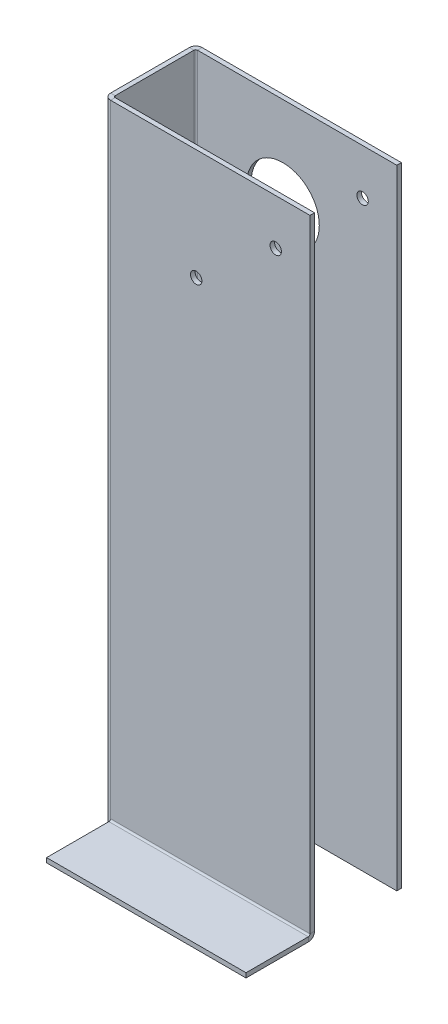
ISO-10303-21;
HEADER;
FILE_DESCRIPTION(('STEP AP214'),'2;1');
FILE_NAME('part.step','',(''),(''),'','','');
FILE_SCHEMA(('AUTOMOTIVE_DESIGN { 1 0 10303 214 1 1 1 1 }'));
ENDSEC;
DATA;
#1=APPLICATION_CONTEXT('core data for automotive mechanical design processes');
#2=APPLICATION_PROTOCOL_DEFINITION('international standard','automotive_design',2000,#1);
#3=PRODUCT_CONTEXT('',#1,'mechanical');
#4=PRODUCT('Part','Part','',(#3));
#5=PRODUCT_RELATED_PRODUCT_CATEGORY('part','',(#4));
#6=PRODUCT_DEFINITION_FORMATION('','',#4);
#7=PRODUCT_DEFINITION_CONTEXT('part definition',#1,'design');
#8=PRODUCT_DEFINITION('design','',#6,#7);
#9=PRODUCT_DEFINITION_SHAPE('','',#8);
#10=(LENGTH_UNIT() NAMED_UNIT(*) SI_UNIT(.MILLI.,.METRE.));
#11=(NAMED_UNIT(*) PLANE_ANGLE_UNIT() SI_UNIT($,.RADIAN.));
#12=(NAMED_UNIT(*) SI_UNIT($,.STERADIAN.) SOLID_ANGLE_UNIT());
#13=UNCERTAINTY_MEASURE_WITH_UNIT(LENGTH_MEASURE(1.E-05),#10,'distance_accuracy_value','');
#14=(GEOMETRIC_REPRESENTATION_CONTEXT(3) GLOBAL_UNCERTAINTY_ASSIGNED_CONTEXT((#13)) GLOBAL_UNIT_ASSIGNED_CONTEXT((#10,
#11,#12)) REPRESENTATION_CONTEXT('',''));
#15=CARTESIAN_POINT('',(0.,0.,0.));
#16=DIRECTION('',(0.,0.,1.));
#17=DIRECTION('',(1.,0.,0.));
#18=AXIS2_PLACEMENT_3D('',#15,#16,#17);
#19=CARTESIAN_POINT('',(2.73660000000001,2.7366,0.));
#20=DIRECTION('',(1.,0.,0.));
#21=DIRECTION('',(0.,1.,0.));
#22=AXIS2_PLACEMENT_3D('',#19,#20,#21);
#23=PLANE('',#22);
#24=DIRECTION('',(0.,1.,0.));
#25=VECTOR('',#24,1.);
#26=CARTESIAN_POINT('',(2.7366,275.,-2.));
#27=LINE('',#26,#25);
#28=CARTESIAN_POINT('',(2.73660000000001,2.73660000000001,-2.));
#29=VERTEX_POINT('',#28);
#30=CARTESIAN_POINT('',(2.7366,0.,-2.));
#31=VERTEX_POINT('',#30);
#32=EDGE_CURVE('E376',#29,#31,#27,.F.);
#33=ORIENTED_EDGE('',*,*,#32,.F.);
#34=CARTESIAN_POINT('',(2.73660000000001,2.7366,0.7366));
#35=DIRECTION('',(1.,0.,0.));
#36=DIRECTION('',(0.,0.,-1.));
#37=AXIS2_PLACEMENT_3D('',#34,#35,#36);
#38=CIRCLE('',#37,2.7366);
#39=CARTESIAN_POINT('',(2.7366,0.100997602065135,0.));
#40=VERTEX_POINT('',#39);
#41=EDGE_CURVE('E269',#29,#40,#38,.F.);
#42=ORIENTED_EDGE('',*,*,#41,.T.);
#43=DIRECTION('',(0.,-1.,0.));
#44=VECTOR('',#43,1.);
#45=CARTESIAN_POINT('',(2.73660000000001,2.7366,0.));
#46=LINE('',#45,#44);
#47=CARTESIAN_POINT('',(2.7366,0.,0.));
#48=VERTEX_POINT('',#47);
#49=EDGE_CURVE('E285',#40,#48,#46,.T.);
#50=ORIENTED_EDGE('',*,*,#49,.T.);
#51=DIRECTION('',(0.,0.,1.));
#52=VECTOR('',#51,1.);
#53=CARTESIAN_POINT('',(2.7366,0.,-2.));
#54=LINE('',#53,#52);
#55=EDGE_CURVE('E120',#31,#48,#54,.T.);
#56=ORIENTED_EDGE('',*,*,#55,.F.);
#57=EDGE_LOOP('',(#33,#42,#50,#56));
#58=FACE_BOUND('',#57,.T.);
#59=ADVANCED_FACE('F97',(#58),#23,.T.);
#60=CARTESIAN_POINT('',(0.,0.,-2.));
#61=DIRECTION('',(0.,0.,-1.));
#62=DIRECTION('',(-1.,0.,0.));
#63=AXIS2_PLACEMENT_3D('',#60,#61,#62);
#64=PLANE('',#63);
#65=CARTESIAN_POINT('',(75.,255.,-2.));
#66=DIRECTION('',(0.,0.,-1.));
#67=DIRECTION('',(-1.,0.,0.));
#68=AXIS2_PLACEMENT_3D('',#65,#66,#67);
#69=CIRCLE('',#68,2.50000000000001);
#70=CARTESIAN_POINT('',(72.5,255.,-2.));
#71=VERTEX_POINT('',#70);
#72=EDGE_CURVE('E527',#71,#71,#69,.F.);
#73=ORIENTED_EDGE('',*,*,#72,.T.);
#74=EDGE_LOOP('',(#73));
#75=FACE_BOUND('',#74,.T.);
#76=CARTESIAN_POINT('',(40.19,226.48,-2.));
#77=DIRECTION('',(0.,0.,-1.));
#78=DIRECTION('',(-1.,0.,0.));
#79=AXIS2_PLACEMENT_3D('',#76,#77,#78);
#80=CIRCLE('',#79,2.5);
#81=CARTESIAN_POINT('',(37.69,226.48,-2.));
#82=VERTEX_POINT('',#81);
#83=EDGE_CURVE('E534',#82,#82,#80,.F.);
#84=ORIENTED_EDGE('',*,*,#83,.T.);
#85=EDGE_LOOP('',(#84));
#86=FACE_BOUND('',#85,.T.);
#87=DIRECTION('',(0.,1.,0.));
#88=VECTOR('',#87,1.);
#89=CARTESIAN_POINT('',(90.,0.,-2.));
#90=LINE('',#89,#88);
#91=CARTESIAN_POINT('',(90.,2.73660000000001,-2.));
#92=VERTEX_POINT('',#91);
#93=CARTESIAN_POINT('',(90.,275.,-2.));
#94=VERTEX_POINT('',#93);
#95=EDGE_CURVE('E382',#92,#94,#90,.T.);
#96=ORIENTED_EDGE('',*,*,#95,.F.);
#97=DIRECTION('',(1.,0.,0.));
#98=VECTOR('',#97,1.);
#99=CARTESIAN_POINT('',(90.,2.7366,-2.));
#100=LINE('',#99,#98);
#101=EDGE_CURVE('E264',#92,#29,#100,.F.);
#102=ORIENTED_EDGE('',*,*,#101,.T.);
#103=CARTESIAN_POINT('',(2.7366,275.,-2.));
#104=VERTEX_POINT('',#103);
#105=EDGE_CURVE('E373',#104,#29,#27,.F.);
#106=ORIENTED_EDGE('',*,*,#105,.F.);
#107=DIRECTION('',(-1.,0.,0.));
#108=VECTOR('',#107,1.);
#109=CARTESIAN_POINT('',(0.,275.,-2.));
#110=LINE('',#109,#108);
#111=EDGE_CURVE('E105',#94,#104,#110,.T.);
#112=ORIENTED_EDGE('',*,*,#111,.F.);
#113=EDGE_LOOP('',(#96,#102,#106,#112));
#114=FACE_BOUND('',#113,.T.);
#115=ADVANCED_FACE('F459',(#75,#86,#114),#64,.T.);
#116=CARTESIAN_POINT('',(0.,0.,0.));
#117=DIRECTION('',(0.,0.,-1.));
#118=DIRECTION('',(-1.,0.,0.));
#119=AXIS2_PLACEMENT_3D('',#116,#117,#118);
#120=PLANE('',#119);
#121=CARTESIAN_POINT('',(75.,255.,0.));
#122=DIRECTION('',(0.,0.,1.));
#123=DIRECTION('',(1.,0.,0.));
#124=AXIS2_PLACEMENT_3D('',#121,#122,#123);
#125=CIRCLE('',#124,2.50000000000001);
#126=CARTESIAN_POINT('',(77.5,255.,0.));
#127=VERTEX_POINT('',#126);
#128=EDGE_CURVE('E531',#127,#127,#125,.T.);
#129=ORIENTED_EDGE('',*,*,#128,.F.);
#130=EDGE_LOOP('',(#129));
#131=FACE_BOUND('',#130,.T.);
#132=CARTESIAN_POINT('',(40.19,226.48,0.));
#133=DIRECTION('',(0.,0.,1.));
#134=DIRECTION('',(1.,0.,0.));
#135=AXIS2_PLACEMENT_3D('',#132,#133,#134);
#136=CIRCLE('',#135,2.5);
#137=CARTESIAN_POINT('',(42.69,226.48,0.));
#138=VERTEX_POINT('',#137);
#139=EDGE_CURVE('E263',#138,#138,#136,.T.);
#140=ORIENTED_EDGE('',*,*,#139,.F.);
#141=EDGE_LOOP('',(#140));
#142=FACE_BOUND('',#141,.T.);
#143=DIRECTION('',(1.,0.,0.));
#144=VECTOR('',#143,1.);
#145=CARTESIAN_POINT('',(90.,2.7366,0.));
#146=LINE('',#145,#144);
#147=CARTESIAN_POINT('',(90.,2.7366,0.));
#148=VERTEX_POINT('',#147);
#149=CARTESIAN_POINT('',(2.73660000000001,2.7366,0.));
#150=VERTEX_POINT('',#149);
#151=EDGE_CURVE('E278',#148,#150,#146,.F.);
#152=ORIENTED_EDGE('',*,*,#151,.F.);
#153=DIRECTION('',(0.,1.,0.));
#154=VECTOR('',#153,1.);
#155=CARTESIAN_POINT('',(90.,0.,0.));
#156=LINE('',#155,#154);
#157=CARTESIAN_POINT('',(90.,275.,0.));
#158=VERTEX_POINT('',#157);
#159=EDGE_CURVE('E380',#148,#158,#156,.T.);
#160=ORIENTED_EDGE('',*,*,#159,.T.);
#161=DIRECTION('',(-1.,0.,0.));
#162=VECTOR('',#161,1.);
#163=CARTESIAN_POINT('',(0.,275.,0.));
#164=LINE('',#163,#162);
#165=CARTESIAN_POINT('',(2.7366,275.,0.));
#166=VERTEX_POINT('',#165);
#167=EDGE_CURVE('E384',#158,#166,#164,.T.);
#168=ORIENTED_EDGE('',*,*,#167,.T.);
#169=DIRECTION('',(0.,1.,0.));
#170=VECTOR('',#169,1.);
#171=CARTESIAN_POINT('',(2.7366,275.,0.));
#172=LINE('',#171,#170);
#173=EDGE_CURVE('E360',#166,#150,#172,.F.);
#174=ORIENTED_EDGE('',*,*,#173,.T.);
#175=EDGE_LOOP('',(#152,#160,#168,#174));
#176=FACE_BOUND('',#175,.T.);
#177=ADVANCED_FACE('F391',(#131,#142,#176),#120,.F.);
#178=CARTESIAN_POINT('',(90.,0.,-2.));
#179=DIRECTION('',(1.,0.,0.));
#180=DIRECTION('',(0.,0.,-1.));
#181=AXIS2_PLACEMENT_3D('',#178,#179,#180);
#182=PLANE('',#181);
#183=ORIENTED_EDGE('',*,*,#159,.F.);
#184=DIRECTION('',(0.,0.,-1.));
#185=VECTOR('',#184,1.);
#186=CARTESIAN_POINT('',(90.,2.7366,0.));
#187=LINE('',#186,#185);
#188=EDGE_CURVE('E272',#148,#92,#187,.T.);
#189=ORIENTED_EDGE('',*,*,#188,.T.);
#190=ORIENTED_EDGE('',*,*,#95,.T.);
#191=DIRECTION('',(0.,0.,1.));
#192=VECTOR('',#191,1.);
#193=CARTESIAN_POINT('',(90.,275.,-2.));
#194=LINE('',#193,#192);
#195=EDGE_CURVE('E13',#94,#158,#194,.T.);
#196=ORIENTED_EDGE('',*,*,#195,.T.);
#197=EDGE_LOOP('',(#183,#189,#190,#196));
#198=FACE_BOUND('',#197,.T.);
#199=ADVANCED_FACE('F99',(#198),#182,.T.);
#200=CARTESIAN_POINT('',(-1.32706345912226E-13,275.,-40.));
#201=DIRECTION('',(0.,-1.,0.));
#202=DIRECTION('',(0.,0.,-1.));
#203=AXIS2_PLACEMENT_3D('',#200,#201,#202);
#204=PLANE('',#203);
#205=DIRECTION('',(-1.,0.,0.));
#206=VECTOR('',#205,1.);
#207=CARTESIAN_POINT('',(1.99999999999987,275.,-37.2634));
#208=LINE('',#207,#206);
#209=CARTESIAN_POINT('',(1.99999999999988,275.,-37.2634));
#210=VERTEX_POINT('',#209);
#211=CARTESIAN_POINT('',(-1.33573707650214E-13,275.,-37.2634));
#212=VERTEX_POINT('',#211);
#213=EDGE_CURVE('E326',#210,#212,#208,.T.);
#214=ORIENTED_EDGE('',*,*,#213,.T.);
#215=DIRECTION('',(0.,0.,-1.));
#216=VECTOR('',#215,1.);
#217=CARTESIAN_POINT('',(0.,275.,0.));
#218=LINE('',#217,#216);
#219=CARTESIAN_POINT('',(0.,275.,-2.73659999999999));
#220=VERTEX_POINT('',#219);
#221=EDGE_CURVE('E344',#220,#212,#218,.T.);
#222=ORIENTED_EDGE('',*,*,#221,.F.);
#223=DIRECTION('',(1.,0.,0.));
#224=VECTOR('',#223,1.);
#225=CARTESIAN_POINT('',(2.,275.,-2.7366));
#226=LINE('',#225,#224);
#227=CARTESIAN_POINT('',(2.,275.,-2.7366));
#228=VERTEX_POINT('',#227);
#229=EDGE_CURVE('E353',#228,#220,#226,.F.);
#230=ORIENTED_EDGE('',*,*,#229,.F.);
#231=DIRECTION('',(0.,0.,1.));
#232=VECTOR('',#231,1.);
#233=CARTESIAN_POINT('',(1.99999999999987,275.,-40.));
#234=LINE('',#233,#232);
#235=EDGE_CURVE('E348',#228,#210,#234,.F.);
#236=ORIENTED_EDGE('',*,*,#235,.T.);
#237=EDGE_LOOP('',(#214,#222,#230,#236));
#238=FACE_BOUND('',#237,.T.);
#239=ADVANCED_FACE('F409',(#238),#204,.F.);
#240=CARTESIAN_POINT('',(0.,0.,-1.99999999999999));
#241=DIRECTION('',(0.,1.,0.));
#242=DIRECTION('',(0.,0.,1.));
#243=AXIS2_PLACEMENT_3D('',#240,#241,#242);
#244=PLANE('',#243);
#245=DIRECTION('',(-1.,0.,0.));
#246=VECTOR('',#245,1.);
#247=CARTESIAN_POINT('',(1.99999999999987,0.,-37.2634));
#248=LINE('',#247,#246);
#249=CARTESIAN_POINT('',(1.99999999999987,0.,-37.2634));
#250=VERTEX_POINT('',#249);
#251=CARTESIAN_POINT('',(-1.2793585635329E-13,0.,-37.2634));
#252=VERTEX_POINT('',#251);
#253=EDGE_CURVE('E335',#250,#252,#248,.T.);
#254=ORIENTED_EDGE('',*,*,#253,.F.);
#255=DIRECTION('',(0.,0.,-1.));
#256=VECTOR('',#255,1.);
#257=CARTESIAN_POINT('',(2.,0.,-2.));
#258=LINE('',#257,#256);
#259=CARTESIAN_POINT('',(2.,0.,-2.7366));
#260=VERTEX_POINT('',#259);
#261=EDGE_CURVE('E346',#250,#260,#258,.F.);
#262=ORIENTED_EDGE('',*,*,#261,.T.);
#263=DIRECTION('',(1.,0.,0.));
#264=VECTOR('',#263,1.);
#265=CARTESIAN_POINT('',(0.,0.,-2.73659999999999));
#266=LINE('',#265,#264);
#267=CARTESIAN_POINT('',(0.,0.,-2.73659999999999));
#268=VERTEX_POINT('',#267);
#269=EDGE_CURVE('E338',#260,#268,#266,.F.);
#270=ORIENTED_EDGE('',*,*,#269,.T.);
#271=DIRECTION('',(0.,0.,1.));
#272=VECTOR('',#271,1.);
#273=CARTESIAN_POINT('',(0.,0.,0.));
#274=LINE('',#273,#272);
#275=EDGE_CURVE('E341',#252,#268,#274,.T.);
#276=ORIENTED_EDGE('',*,*,#275,.F.);
#277=EDGE_LOOP('',(#254,#262,#270,#276));
#278=FACE_BOUND('',#277,.T.);
#279=ADVANCED_FACE('F560',(#278),#244,.F.);
#280=CARTESIAN_POINT('',(0.,0.,0.));
#281=DIRECTION('',(1.,0.,0.));
#282=DIRECTION('',(0.,0.,-1.));
#283=AXIS2_PLACEMENT_3D('',#280,#281,#282);
#284=PLANE('',#283);
#285=DIRECTION('',(0.,1.,0.));
#286=VECTOR('',#285,1.);
#287=CARTESIAN_POINT('',(-1.33573707650214E-13,275.,-37.2634));
#288=LINE('',#287,#286);
#289=EDGE_CURVE('E320',#212,#252,#288,.F.);
#290=ORIENTED_EDGE('',*,*,#289,.T.);
#291=ORIENTED_EDGE('',*,*,#275,.T.);
#292=DIRECTION('',(0.,1.,0.));
#293=VECTOR('',#292,1.);
#294=CARTESIAN_POINT('',(0.,0.,-2.73659999999999));
#295=LINE('',#294,#293);
#296=EDGE_CURVE('E350',#220,#268,#295,.F.);
#297=ORIENTED_EDGE('',*,*,#296,.F.);
#298=ORIENTED_EDGE('',*,*,#221,.T.);
#299=EDGE_LOOP('',(#290,#291,#297,#298));
#300=FACE_BOUND('',#299,.T.);
#301=ADVANCED_FACE('F406',(#300),#284,.F.);
#302=CARTESIAN_POINT('',(2.00000000000001,0.,0.));
#303=DIRECTION('',(1.,0.,0.));
#304=DIRECTION('',(0.,0.,-1.));
#305=AXIS2_PLACEMENT_3D('',#302,#303,#304);
#306=PLANE('',#305);
#307=ORIENTED_EDGE('',*,*,#261,.F.);
#308=DIRECTION('',(0.,1.,0.));
#309=VECTOR('',#308,1.);
#310=CARTESIAN_POINT('',(1.99999999999987,275.,-37.2634));
#311=LINE('',#310,#309);
#312=EDGE_CURVE('E112',#210,#250,#311,.F.);
#313=ORIENTED_EDGE('',*,*,#312,.F.);
#314=ORIENTED_EDGE('',*,*,#235,.F.);
#315=DIRECTION('',(0.,1.,0.));
#316=VECTOR('',#315,1.);
#317=CARTESIAN_POINT('',(2.,0.,-2.7366));
#318=LINE('',#317,#316);
#319=EDGE_CURVE('E356',#260,#228,#318,.T.);
#320=ORIENTED_EDGE('',*,*,#319,.F.);
#321=EDGE_LOOP('',(#307,#313,#314,#320));
#322=FACE_BOUND('',#321,.T.);
#323=ADVANCED_FACE('F561',(#322),#306,.T.);
#324=CARTESIAN_POINT('',(0.,275.,-2.));
#325=DIRECTION('',(0.,1.,0.));
#326=DIRECTION('',(0.,0.,1.));
#327=AXIS2_PLACEMENT_3D('',#324,#325,#326);
#328=PLANE('',#327);
#329=ORIENTED_EDGE('',*,*,#111,.T.);
#330=DIRECTION('',(0.,0.,1.));
#331=VECTOR('',#330,1.);
#332=CARTESIAN_POINT('',(2.7366,275.,-2.));
#333=LINE('',#332,#331);
#334=EDGE_CURVE('E367',#104,#166,#333,.T.);
#335=ORIENTED_EDGE('',*,*,#334,.T.);
#336=ORIENTED_EDGE('',*,*,#167,.F.);
#337=ORIENTED_EDGE('',*,*,#195,.F.);
#338=EDGE_LOOP('',(#329,#335,#336,#337));
#339=FACE_BOUND('',#338,.T.);
#340=ADVANCED_FACE('F563',(#339),#328,.T.);
#341=CARTESIAN_POINT('',(2.7366,0.,-2.7366));
#342=DIRECTION('',(0.,-1.,0.));
#343=DIRECTION('',(0.,0.,-1.));
#344=AXIS2_PLACEMENT_3D('',#341,#342,#343);
#345=PLANE('',#344);
#346=ORIENTED_EDGE('',*,*,#269,.F.);
#347=CARTESIAN_POINT('',(2.7366,0.,-2.7366));
#348=DIRECTION('',(0.,1.,0.));
#349=DIRECTION('',(0.,0.,1.));
#350=AXIS2_PLACEMENT_3D('',#347,#348,#349);
#351=CIRCLE('',#350,0.7366);
#352=EDGE_CURVE('E370',#31,#260,#351,.F.);
#353=ORIENTED_EDGE('',*,*,#352,.F.);
#354=ORIENTED_EDGE('',*,*,#55,.T.);
#355=CARTESIAN_POINT('',(2.7366,0.,-2.7366));
#356=DIRECTION('',(0.,1.,0.));
#357=DIRECTION('',(0.,0.,1.));
#358=AXIS2_PLACEMENT_3D('',#355,#356,#357);
#359=CIRCLE('',#358,2.7366);
#360=EDGE_CURVE('E363',#48,#268,#359,.F.);
#361=ORIENTED_EDGE('',*,*,#360,.T.);
#362=EDGE_LOOP('',(#346,#353,#354,#361));
#363=FACE_BOUND('',#362,.T.);
#364=ADVANCED_FACE('F558',(#363),#345,.T.);
#365=CARTESIAN_POINT('',(2.7366,275.,-2.7366));
#366=DIRECTION('',(0.,-1.,0.));
#367=DIRECTION('',(0.,0.,-1.));
#368=AXIS2_PLACEMENT_3D('',#365,#366,#367);
#369=PLANE('',#368);
#370=CARTESIAN_POINT('',(2.7366,275.,-2.7366));
#371=DIRECTION('',(0.,1.,0.));
#372=DIRECTION('',(0.,0.,1.));
#373=AXIS2_PLACEMENT_3D('',#370,#371,#372);
#374=CIRCLE('',#373,0.7366);
#375=EDGE_CURVE('E343',#228,#104,#374,.T.);
#376=ORIENTED_EDGE('',*,*,#375,.F.);
#377=ORIENTED_EDGE('',*,*,#229,.T.);
#378=CARTESIAN_POINT('',(2.7366,275.,-2.7366));
#379=DIRECTION('',(0.,1.,0.));
#380=DIRECTION('',(0.,0.,1.));
#381=AXIS2_PLACEMENT_3D('',#378,#379,#380);
#382=CIRCLE('',#381,2.7366);
#383=EDGE_CURVE('E364',#220,#166,#382,.T.);
#384=ORIENTED_EDGE('',*,*,#383,.T.);
#385=ORIENTED_EDGE('',*,*,#334,.F.);
#386=EDGE_LOOP('',(#376,#377,#384,#385));
#387=FACE_BOUND('',#386,.T.);
#388=ADVANCED_FACE('F400',(#387),#369,.F.);
#389=CARTESIAN_POINT('',(2.7366,275.,-2.7366));
#390=DIRECTION('',(0.,1.,0.));
#391=DIRECTION('',(-1.,0.,0.));
#392=AXIS2_PLACEMENT_3D('',#389,#390,#391);
#393=CYLINDRICAL_SURFACE('',#392,2.7366);
#394=ORIENTED_EDGE('',*,*,#173,.F.);
#395=ORIENTED_EDGE('',*,*,#383,.F.);
#396=ORIENTED_EDGE('',*,*,#296,.T.);
#397=ORIENTED_EDGE('',*,*,#360,.F.);
#398=ORIENTED_EDGE('',*,*,#49,.F.);
#399=EDGE_CURVE('E286',#150,#40,#46,.T.);
#400=ORIENTED_EDGE('',*,*,#399,.F.);
#401=EDGE_LOOP('',(#394,#395,#396,#397,#398,#400));
#402=FACE_BOUND('',#401,.T.);
#403=ADVANCED_FACE('F396',(#402),#393,.T.);
#404=CARTESIAN_POINT('',(2.7366,275.,-2.7366));
#405=DIRECTION('',(0.,1.,0.));
#406=DIRECTION('',(-1.,0.,0.));
#407=AXIS2_PLACEMENT_3D('',#404,#405,#406);
#408=CYLINDRICAL_SURFACE('',#407,0.7366);
#409=ORIENTED_EDGE('',*,*,#105,.T.);
#410=ORIENTED_EDGE('',*,*,#32,.T.);
#411=ORIENTED_EDGE('',*,*,#352,.T.);
#412=ORIENTED_EDGE('',*,*,#319,.T.);
#413=ORIENTED_EDGE('',*,*,#375,.T.);
#414=EDGE_LOOP('',(#409,#410,#411,#412,#413));
#415=FACE_BOUND('',#414,.T.);
#416=ADVANCED_FACE('F554',(#415),#408,.F.);
#417=CARTESIAN_POINT('',(2.73659999999987,0.,-37.2634));
#418=DIRECTION('',(0.,-1.,0.));
#419=DIRECTION('',(0.,0.,-1.));
#420=AXIS2_PLACEMENT_3D('',#417,#418,#419);
#421=PLANE('',#420);
#422=DIRECTION('',(0.,0.,1.));
#423=VECTOR('',#422,1.);
#424=CARTESIAN_POINT('',(2.73659999999987,0.,-40.));
#425=LINE('',#424,#423);
#426=CARTESIAN_POINT('',(2.73659999999987,0.,-38.));
#427=VERTEX_POINT('',#426);
#428=CARTESIAN_POINT('',(2.73659999999985,0.,-40.));
#429=VERTEX_POINT('',#428);
#430=EDGE_CURVE('E289',#427,#429,#425,.F.);
#431=ORIENTED_EDGE('',*,*,#430,.F.);
#432=CARTESIAN_POINT('',(2.73659999999987,0.,-37.2634));
#433=DIRECTION('',(0.,1.,0.));
#434=DIRECTION('',(0.,0.,1.));
#435=AXIS2_PLACEMENT_3D('',#432,#433,#434);
#436=CIRCLE('',#435,0.736600000000004);
#437=EDGE_CURVE('E329',#250,#427,#436,.F.);
#438=ORIENTED_EDGE('',*,*,#437,.F.);
#439=ORIENTED_EDGE('',*,*,#253,.T.);
#440=CARTESIAN_POINT('',(2.73659999999987,0.,-37.2634));
#441=DIRECTION('',(0.,1.,0.));
#442=DIRECTION('',(0.,0.,1.));
#443=AXIS2_PLACEMENT_3D('',#440,#441,#442);
#444=CIRCLE('',#443,2.7366);
#445=EDGE_CURVE('E322',#252,#429,#444,.F.);
#446=ORIENTED_EDGE('',*,*,#445,.T.);
#447=EDGE_LOOP('',(#431,#438,#439,#446));
#448=FACE_BOUND('',#447,.T.);
#449=ADVANCED_FACE('F438',(#448),#421,.T.);
#450=CARTESIAN_POINT('',(2.73659999999987,275.,-37.2634));
#451=DIRECTION('',(0.,-1.,0.));
#452=DIRECTION('',(0.,0.,-1.));
#453=AXIS2_PLACEMENT_3D('',#450,#451,#452);
#454=PLANE('',#453);
#455=CARTESIAN_POINT('',(2.73659999999987,275.,-37.2634));
#456=DIRECTION('',(0.,1.,0.));
#457=DIRECTION('',(0.,0.,1.));
#458=AXIS2_PLACEMENT_3D('',#455,#456,#457);
#459=CIRCLE('',#458,0.736600000000004);
#460=CARTESIAN_POINT('',(2.73659999999987,275.,-38.));
#461=VERTEX_POINT('',#460);
#462=EDGE_CURVE('E293',#461,#210,#459,.T.);
#463=ORIENTED_EDGE('',*,*,#462,.F.);
#464=DIRECTION('',(0.,0.,1.));
#465=VECTOR('',#464,1.);
#466=CARTESIAN_POINT('',(2.73659999999987,275.,-38.));
#467=LINE('',#466,#465);
#468=CARTESIAN_POINT('',(2.73659999999987,275.,-40.));
#469=VERTEX_POINT('',#468);
#470=EDGE_CURVE('E313',#461,#469,#467,.F.);
#471=ORIENTED_EDGE('',*,*,#470,.T.);
#472=CARTESIAN_POINT('',(2.73659999999987,275.,-37.2634));
#473=DIRECTION('',(0.,1.,0.));
#474=DIRECTION('',(0.,0.,1.));
#475=AXIS2_PLACEMENT_3D('',#472,#473,#474);
#476=CIRCLE('',#475,2.7366);
#477=EDGE_CURVE('E323',#469,#212,#476,.T.);
#478=ORIENTED_EDGE('',*,*,#477,.T.);
#479=ORIENTED_EDGE('',*,*,#213,.F.);
#480=EDGE_LOOP('',(#463,#471,#478,#479));
#481=FACE_BOUND('',#480,.T.);
#482=ADVANCED_FACE('F417',(#481),#454,.F.);
#483=CARTESIAN_POINT('',(2.73659999999987,275.,-37.2634));
#484=DIRECTION('',(0.,1.,0.));
#485=DIRECTION('',(0.,0.,-1.));
#486=AXIS2_PLACEMENT_3D('',#483,#484,#485);
#487=CYLINDRICAL_SURFACE('',#486,2.7366);
#488=ORIENTED_EDGE('',*,*,#289,.F.);
#489=ORIENTED_EDGE('',*,*,#477,.F.);
#490=DIRECTION('',(0.,1.,0.));
#491=VECTOR('',#490,1.);
#492=CARTESIAN_POINT('',(2.73659999999987,0.,-40.));
#493=LINE('',#492,#491);
#494=EDGE_CURVE('E311',#469,#429,#493,.F.);
#495=ORIENTED_EDGE('',*,*,#494,.T.);
#496=ORIENTED_EDGE('',*,*,#445,.F.);
#497=EDGE_LOOP('',(#488,#489,#495,#496));
#498=FACE_BOUND('',#497,.T.);
#499=ADVANCED_FACE('F416',(#498),#487,.T.);
#500=CARTESIAN_POINT('',(2.73659999999987,275.,-37.2634));
#501=DIRECTION('',(0.,1.,0.));
#502=DIRECTION('',(0.,0.,-1.));
#503=AXIS2_PLACEMENT_3D('',#500,#501,#502);
#504=CYLINDRICAL_SURFACE('',#503,0.736600000000004);
#505=ORIENTED_EDGE('',*,*,#312,.T.);
#506=ORIENTED_EDGE('',*,*,#437,.T.);
#507=DIRECTION('',(0.,1.,0.));
#508=VECTOR('',#507,1.);
#509=CARTESIAN_POINT('',(2.73659999999987,0.,-38.));
#510=LINE('',#509,#508);
#511=EDGE_CURVE('E316',#427,#461,#510,.T.);
#512=ORIENTED_EDGE('',*,*,#511,.T.);
#513=ORIENTED_EDGE('',*,*,#462,.T.);
#514=EDGE_LOOP('',(#505,#506,#512,#513));
#515=FACE_BOUND('',#514,.T.);
#516=ADVANCED_FACE('F441',(#515),#504,.F.);
#517=CARTESIAN_POINT('',(89.9999999999999,275.,-40.0000000000006));
#518=DIRECTION('',(0.,-1.,0.));
#519=DIRECTION('',(0.,0.,-1.));
#520=AXIS2_PLACEMENT_3D('',#517,#518,#519);
#521=PLANE('',#520);
#522=ORIENTED_EDGE('',*,*,#470,.F.);
#523=DIRECTION('',(-1.,0.,0.));
#524=VECTOR('',#523,1.);
#525=CARTESIAN_POINT('',(89.9999999999999,275.,-38.0000000000006));
#526=LINE('',#525,#524);
#527=CARTESIAN_POINT('',(89.9999999999999,275.,-38.0000000000006));
#528=VERTEX_POINT('',#527);
#529=EDGE_CURVE('E309',#461,#528,#526,.F.);
#530=ORIENTED_EDGE('',*,*,#529,.T.);
#531=DIRECTION('',(0.,0.,1.));
#532=VECTOR('',#531,1.);
#533=CARTESIAN_POINT('',(89.9999999999999,275.,-40.0000000000006));
#534=LINE('',#533,#532);
#535=CARTESIAN_POINT('',(89.9999999999999,275.,-40.0000000000006));
#536=VERTEX_POINT('',#535);
#537=EDGE_CURVE('E290',#536,#528,#534,.T.);
#538=ORIENTED_EDGE('',*,*,#537,.F.);
#539=DIRECTION('',(1.,0.,0.));
#540=VECTOR('',#539,1.);
#541=CARTESIAN_POINT('',(-2.8769276151757E-13,275.,-40.));
#542=LINE('',#541,#540);
#543=EDGE_CURVE('E302',#469,#536,#542,.T.);
#544=ORIENTED_EDGE('',*,*,#543,.F.);
#545=EDGE_LOOP('',(#522,#530,#538,#544));
#546=FACE_BOUND('',#545,.T.);
#547=ADVANCED_FACE('F428',(#546),#521,.F.);
#548=CARTESIAN_POINT('',(1.99999999999986,0.,-40.));
#549=DIRECTION('',(0.,1.,0.));
#550=DIRECTION('',(0.,0.,1.));
#551=AXIS2_PLACEMENT_3D('',#548,#549,#550);
#552=PLANE('',#551);
#553=ORIENTED_EDGE('',*,*,#430,.T.);
#554=DIRECTION('',(-1.,0.,0.));
#555=VECTOR('',#554,1.);
#556=CARTESIAN_POINT('',(-2.8769276151757E-13,0.,-40.));
#557=LINE('',#556,#555);
#558=CARTESIAN_POINT('',(89.9999999999999,0.,-40.0000000000006));
#559=VERTEX_POINT('',#558);
#560=EDGE_CURVE('E297',#559,#429,#557,.T.);
#561=ORIENTED_EDGE('',*,*,#560,.F.);
#562=DIRECTION('',(0.,0.,1.));
#563=VECTOR('',#562,1.);
#564=CARTESIAN_POINT('',(89.9999999999999,0.,-40.0000000000006));
#565=LINE('',#564,#563);
#566=CARTESIAN_POINT('',(89.9999999999999,0.,-38.0000000000006));
#567=VERTEX_POINT('',#566);
#568=EDGE_CURVE('E294',#559,#567,#565,.T.);
#569=ORIENTED_EDGE('',*,*,#568,.T.);
#570=DIRECTION('',(1.,0.,0.));
#571=VECTOR('',#570,1.);
#572=CARTESIAN_POINT('',(1.99999999999987,0.,-38.));
#573=LINE('',#572,#571);
#574=EDGE_CURVE('E304',#567,#427,#573,.F.);
#575=ORIENTED_EDGE('',*,*,#574,.T.);
#576=EDGE_LOOP('',(#553,#561,#569,#575));
#577=FACE_BOUND('',#576,.T.);
#578=ADVANCED_FACE('F435',(#577),#552,.F.);
#579=CARTESIAN_POINT('',(-2.8769276151757E-13,0.,-40.));
#580=DIRECTION('',(0.,0.,1.));
#581=DIRECTION('',(1.,0.,0.));
#582=AXIS2_PLACEMENT_3D('',#579,#580,#581);
#583=PLANE('',#582);
#584=CARTESIAN_POINT('',(74.9999999999997,255.,-40.0000000000005));
#585=DIRECTION('',(0.,0.,-1.));
#586=DIRECTION('',(-1.,0.,0.));
#587=AXIS2_PLACEMENT_3D('',#584,#585,#586);
#588=CIRCLE('',#587,2.50000000000001);
#589=CARTESIAN_POINT('',(72.4999999999997,255.,-40.0000000000005));
#590=VERTEX_POINT('',#589);
#591=EDGE_CURVE('E518',#590,#590,#588,.T.);
#592=ORIENTED_EDGE('',*,*,#591,.F.);
#593=EDGE_LOOP('',(#592));
#594=FACE_BOUND('',#593,.T.);
#595=CARTESIAN_POINT('',(40.1865999999999,235.2,-40.0000000000003));
#596=DIRECTION('',(0.,0.,-1.));
#597=DIRECTION('',(-1.,0.,0.));
#598=AXIS2_PLACEMENT_3D('',#595,#596,#597);
#599=CIRCLE('',#598,15.875);
#600=CARTESIAN_POINT('',(24.3115999999998,235.2,-40.0000000000002));
#601=VERTEX_POINT('',#600);
#602=EDGE_CURVE('E522',#601,#601,#599,.T.);
#603=ORIENTED_EDGE('',*,*,#602,.F.);
#604=EDGE_LOOP('',(#603));
#605=FACE_BOUND('',#604,.T.);
#606=ORIENTED_EDGE('',*,*,#494,.F.);
#607=ORIENTED_EDGE('',*,*,#543,.T.);
#608=DIRECTION('',(0.,-1.,0.));
#609=VECTOR('',#608,1.);
#610=CARTESIAN_POINT('',(89.9999999999999,0.,-40.0000000000006));
#611=LINE('',#610,#609);
#612=EDGE_CURVE('E300',#536,#559,#611,.T.);
#613=ORIENTED_EDGE('',*,*,#612,.T.);
#614=ORIENTED_EDGE('',*,*,#560,.T.);
#615=EDGE_LOOP('',(#606,#607,#613,#614));
#616=FACE_BOUND('',#615,.T.);
#617=ADVANCED_FACE('F424',(#594,#605,#616),#583,.F.);
#618=CARTESIAN_POINT('',(-2.73726836162197E-13,0.,-38.));
#619=DIRECTION('',(0.,0.,1.));
#620=DIRECTION('',(1.,0.,0.));
#621=AXIS2_PLACEMENT_3D('',#618,#619,#620);
#622=PLANE('',#621);
#623=CARTESIAN_POINT('',(74.9999999999997,255.,-38.0000000000005));
#624=DIRECTION('',(0.,0.,1.));
#625=DIRECTION('',(1.,0.,0.));
#626=AXIS2_PLACEMENT_3D('',#623,#624,#625);
#627=CIRCLE('',#626,2.50000000000001);
#628=CARTESIAN_POINT('',(77.4999999999997,255.,-38.0000000000005));
#629=VERTEX_POINT('',#628);
#630=EDGE_CURVE('E515',#629,#629,#627,.F.);
#631=ORIENTED_EDGE('',*,*,#630,.T.);
#632=EDGE_LOOP('',(#631));
#633=FACE_BOUND('',#632,.T.);
#634=CARTESIAN_POINT('',(40.1865999999999,235.2,-38.0000000000003));
#635=DIRECTION('',(0.,0.,1.));
#636=DIRECTION('',(1.,0.,0.));
#637=AXIS2_PLACEMENT_3D('',#634,#635,#636);
#638=CIRCLE('',#637,15.875);
#639=CARTESIAN_POINT('',(56.0615999999999,235.2,-38.0000000000004));
#640=VERTEX_POINT('',#639);
#641=EDGE_CURVE('E519',#640,#640,#638,.F.);
#642=ORIENTED_EDGE('',*,*,#641,.T.);
#643=EDGE_LOOP('',(#642));
#644=FACE_BOUND('',#643,.T.);
#645=ORIENTED_EDGE('',*,*,#529,.F.);
#646=ORIENTED_EDGE('',*,*,#511,.F.);
#647=ORIENTED_EDGE('',*,*,#574,.F.);
#648=DIRECTION('',(0.,1.,0.));
#649=VECTOR('',#648,1.);
#650=CARTESIAN_POINT('',(89.9999999999999,0.,-38.0000000000006));
#651=LINE('',#650,#649);
#652=EDGE_CURVE('E307',#528,#567,#651,.F.);
#653=ORIENTED_EDGE('',*,*,#652,.F.);
#654=EDGE_LOOP('',(#645,#646,#647,#653));
#655=FACE_BOUND('',#654,.T.);
#656=ADVANCED_FACE('F443',(#633,#644,#655),#622,.T.);
#657=CARTESIAN_POINT('',(89.9999999999999,0.,-40.0000000000006));
#658=DIRECTION('',(-1.,0.,0.));
#659=DIRECTION('',(0.,0.,1.));
#660=AXIS2_PLACEMENT_3D('',#657,#658,#659);
#661=PLANE('',#660);
#662=ORIENTED_EDGE('',*,*,#652,.T.);
#663=ORIENTED_EDGE('',*,*,#568,.F.);
#664=ORIENTED_EDGE('',*,*,#612,.F.);
#665=ORIENTED_EDGE('',*,*,#537,.T.);
#666=EDGE_LOOP('',(#662,#663,#664,#665));
#667=FACE_BOUND('',#666,.T.);
#668=ADVANCED_FACE('F431',(#667),#661,.F.);
#669=CARTESIAN_POINT('',(2.73660000000001,2.7366,0.7366));
#670=DIRECTION('',(-1.,0.,0.));
#671=DIRECTION('',(0.,0.,1.));
#672=AXIS2_PLACEMENT_3D('',#669,#670,#671);
#673=PLANE('',#672);
#674=CARTESIAN_POINT('',(2.73660000000001,2.7366,0.7366));
#675=DIRECTION('',(1.,0.,0.));
#676=DIRECTION('',(0.,0.,-1.));
#677=AXIS2_PLACEMENT_3D('',#674,#675,#676);
#678=CIRCLE('',#677,0.7366);
#679=CARTESIAN_POINT('',(2.73660000000001,2.,0.736599999999997));
#680=VERTEX_POINT('',#679);
#681=EDGE_CURVE('E275',#150,#680,#678,.F.);
#682=ORIENTED_EDGE('',*,*,#681,.F.);
#683=ORIENTED_EDGE('',*,*,#399,.T.);
#684=CARTESIAN_POINT('',(2.73660000000001,0.,0.73659999999999));
#685=VERTEX_POINT('',#684);
#686=EDGE_CURVE('E267',#40,#685,#38,.F.);
#687=ORIENTED_EDGE('',*,*,#686,.T.);
#688=DIRECTION('',(0.,1.,0.));
#689=VECTOR('',#688,1.);
#690=CARTESIAN_POINT('',(2.7366,0.,0.73659999999999));
#691=LINE('',#690,#689);
#692=EDGE_CURVE('E245',#680,#685,#691,.F.);
#693=ORIENTED_EDGE('',*,*,#692,.F.);
#694=EDGE_LOOP('',(#682,#683,#687,#693));
#695=FACE_BOUND('',#694,.T.);
#696=ADVANCED_FACE('F451',(#695),#673,.T.);
#697=CARTESIAN_POINT('',(90.,2.7366,0.7366));
#698=DIRECTION('',(-1.,0.,0.));
#699=DIRECTION('',(0.,0.,1.));
#700=AXIS2_PLACEMENT_3D('',#697,#698,#699);
#701=PLANE('',#700);
#702=CARTESIAN_POINT('',(90.,2.7366,0.7366));
#703=DIRECTION('',(1.,0.,0.));
#704=DIRECTION('',(0.,0.,-1.));
#705=AXIS2_PLACEMENT_3D('',#702,#703,#704);
#706=CIRCLE('',#705,0.7366);
#707=CARTESIAN_POINT('',(90.,2.,0.736599999999997));
#708=VERTEX_POINT('',#707);
#709=EDGE_CURVE('E281',#708,#148,#706,.T.);
#710=ORIENTED_EDGE('',*,*,#709,.F.);
#711=DIRECTION('',(0.,1.,0.));
#712=VECTOR('',#711,1.);
#713=CARTESIAN_POINT('',(90.,2.,0.736599999999997));
#714=LINE('',#713,#712);
#715=CARTESIAN_POINT('',(90.,0.,0.73659999999999));
#716=VERTEX_POINT('',#715);
#717=EDGE_CURVE('E257',#708,#716,#714,.F.);
#718=ORIENTED_EDGE('',*,*,#717,.T.);
#719=CARTESIAN_POINT('',(90.,2.7366,0.7366));
#720=DIRECTION('',(1.,0.,0.));
#721=DIRECTION('',(0.,0.,-1.));
#722=AXIS2_PLACEMENT_3D('',#719,#720,#721);
#723=CIRCLE('',#722,2.7366);
#724=EDGE_CURVE('E268',#716,#92,#723,.T.);
#725=ORIENTED_EDGE('',*,*,#724,.T.);
#726=ORIENTED_EDGE('',*,*,#188,.F.);
#727=EDGE_LOOP('',(#710,#718,#725,#726));
#728=FACE_BOUND('',#727,.T.);
#729=ADVANCED_FACE('F467',(#728),#701,.F.);
#730=CARTESIAN_POINT('',(90.,2.7366,0.7366));
#731=DIRECTION('',(1.,0.,0.));
#732=DIRECTION('',(0.,-1.,0.));
#733=AXIS2_PLACEMENT_3D('',#730,#731,#732);
#734=CYLINDRICAL_SURFACE('',#733,2.7366);
#735=ORIENTED_EDGE('',*,*,#101,.F.);
#736=ORIENTED_EDGE('',*,*,#724,.F.);
#737=DIRECTION('',(1.,0.,0.));
#738=VECTOR('',#737,1.);
#739=CARTESIAN_POINT('',(2.7366,0.,0.73659999999999));
#740=LINE('',#739,#738);
#741=EDGE_CURVE('E254',#716,#685,#740,.F.);
#742=ORIENTED_EDGE('',*,*,#741,.T.);
#743=ORIENTED_EDGE('',*,*,#686,.F.);
#744=ORIENTED_EDGE('',*,*,#41,.F.);
#745=EDGE_LOOP('',(#735,#736,#742,#743,#744));
#746=FACE_BOUND('',#745,.T.);
#747=ADVANCED_FACE('F470',(#746),#734,.T.);
#748=CARTESIAN_POINT('',(90.,2.7366,0.7366));
#749=DIRECTION('',(1.,0.,0.));
#750=DIRECTION('',(0.,-1.,0.));
#751=AXIS2_PLACEMENT_3D('',#748,#749,#750);
#752=CYLINDRICAL_SURFACE('',#751,0.7366);
#753=ORIENTED_EDGE('',*,*,#151,.T.);
#754=ORIENTED_EDGE('',*,*,#681,.T.);
#755=DIRECTION('',(1.,0.,0.));
#756=VECTOR('',#755,1.);
#757=CARTESIAN_POINT('',(2.7366,2.,0.736599999999997));
#758=LINE('',#757,#756);
#759=EDGE_CURVE('E260',#680,#708,#758,.T.);
#760=ORIENTED_EDGE('',*,*,#759,.T.);
#761=ORIENTED_EDGE('',*,*,#709,.T.);
#762=EDGE_LOOP('',(#753,#754,#760,#761));
#763=FACE_BOUND('',#762,.T.);
#764=ADVANCED_FACE('F475',(#763),#752,.F.);
#765=CARTESIAN_POINT('',(2.7366,0.,0.));
#766=DIRECTION('',(1.,0.,0.));
#767=DIRECTION('',(0.,0.,-1.));
#768=AXIS2_PLACEMENT_3D('',#765,#766,#767);
#769=PLANE('',#768);
#770=ORIENTED_EDGE('',*,*,#692,.T.);
#771=DIRECTION('',(0.,0.,-1.));
#772=VECTOR('',#771,1.);
#773=CARTESIAN_POINT('',(2.7366,0.,0.));
#774=LINE('',#773,#772);
#775=CARTESIAN_POINT('',(2.7366,0.,28.));
#776=VERTEX_POINT('',#775);
#777=EDGE_CURVE('E226',#776,#685,#774,.T.);
#778=ORIENTED_EDGE('',*,*,#777,.F.);
#779=DIRECTION('',(0.,1.,0.));
#780=VECTOR('',#779,1.);
#781=CARTESIAN_POINT('',(2.7366,0.,28.));
#782=LINE('',#781,#780);
#783=CARTESIAN_POINT('',(2.7366,1.9999999999999,28.));
#784=VERTEX_POINT('',#783);
#785=EDGE_CURVE('E232',#776,#784,#782,.T.);
#786=ORIENTED_EDGE('',*,*,#785,.T.);
#787=DIRECTION('',(0.,0.,1.));
#788=VECTOR('',#787,1.);
#789=CARTESIAN_POINT('',(2.7366,2.,0.));
#790=LINE('',#789,#788);
#791=EDGE_CURVE('E252',#784,#680,#790,.F.);
#792=ORIENTED_EDGE('',*,*,#791,.T.);
#793=EDGE_LOOP('',(#770,#778,#786,#792));
#794=FACE_BOUND('',#793,.T.);
#795=ADVANCED_FACE('F244',(#794),#769,.F.);
#796=CARTESIAN_POINT('',(90.,0.,28.));
#797=DIRECTION('',(-1.,0.,0.));
#798=DIRECTION('',(0.,0.,1.));
#799=AXIS2_PLACEMENT_3D('',#796,#797,#798);
#800=PLANE('',#799);
#801=ORIENTED_EDGE('',*,*,#717,.F.);
#802=DIRECTION('',(0.,0.,-1.));
#803=VECTOR('',#802,1.);
#804=CARTESIAN_POINT('',(90.,1.9999999999999,28.));
#805=LINE('',#804,#803);
#806=CARTESIAN_POINT('',(90.,1.9999999999999,28.));
#807=VERTEX_POINT('',#806);
#808=EDGE_CURVE('E248',#708,#807,#805,.F.);
#809=ORIENTED_EDGE('',*,*,#808,.T.);
#810=DIRECTION('',(0.,1.,0.));
#811=VECTOR('',#810,1.);
#812=CARTESIAN_POINT('',(90.,0.,28.));
#813=LINE('',#812,#811);
#814=CARTESIAN_POINT('',(90.,0.,28.));
#815=VERTEX_POINT('',#814);
#816=EDGE_CURVE('E241',#815,#807,#813,.T.);
#817=ORIENTED_EDGE('',*,*,#816,.F.);
#818=DIRECTION('',(0.,0.,1.));
#819=VECTOR('',#818,1.);
#820=CARTESIAN_POINT('',(90.,0.,0.));
#821=LINE('',#820,#819);
#822=EDGE_CURVE('E228',#716,#815,#821,.T.);
#823=ORIENTED_EDGE('',*,*,#822,.F.);
#824=EDGE_LOOP('',(#801,#809,#817,#823));
#825=FACE_BOUND('',#824,.T.);
#826=ADVANCED_FACE('F484',(#825),#800,.F.);
#827=CARTESIAN_POINT('',(0.,0.,0.));
#828=DIRECTION('',(0.,1.,0.));
#829=DIRECTION('',(0.,0.,1.));
#830=AXIS2_PLACEMENT_3D('',#827,#828,#829);
#831=PLANE('',#830);
#832=ORIENTED_EDGE('',*,*,#741,.F.);
#833=ORIENTED_EDGE('',*,*,#822,.T.);
#834=DIRECTION('',(-1.,0.,0.));
#835=VECTOR('',#834,1.);
#836=CARTESIAN_POINT('',(0.,0.,28.));
#837=LINE('',#836,#835);
#838=EDGE_CURVE('E221',#815,#776,#837,.T.);
#839=ORIENTED_EDGE('',*,*,#838,.T.);
#840=ORIENTED_EDGE('',*,*,#777,.T.);
#841=EDGE_LOOP('',(#832,#833,#839,#840));
#842=FACE_BOUND('',#841,.T.);
#843=ADVANCED_FACE('F224',(#842),#831,.F.);
#844=CARTESIAN_POINT('',(0.,2.,0.));
#845=DIRECTION('',(0.,1.,0.));
#846=DIRECTION('',(0.,0.,1.));
#847=AXIS2_PLACEMENT_3D('',#844,#845,#846);
#848=PLANE('',#847);
#849=ORIENTED_EDGE('',*,*,#808,.F.);
#850=ORIENTED_EDGE('',*,*,#759,.F.);
#851=ORIENTED_EDGE('',*,*,#791,.F.);
#852=DIRECTION('',(1.,0.,0.));
#853=VECTOR('',#852,1.);
#854=CARTESIAN_POINT('',(2.7366,1.9999999999999,28.));
#855=LINE('',#854,#853);
#856=EDGE_CURVE('E237',#807,#784,#855,.F.);
#857=ORIENTED_EDGE('',*,*,#856,.F.);
#858=EDGE_LOOP('',(#849,#850,#851,#857));
#859=FACE_BOUND('',#858,.T.);
#860=ADVANCED_FACE('F491',(#859),#848,.T.);
#861=CARTESIAN_POINT('',(2.7366,0.,28.));
#862=DIRECTION('',(0.,0.,-1.));
#863=DIRECTION('',(0.,1.,0.));
#864=AXIS2_PLACEMENT_3D('',#861,#862,#863);
#865=PLANE('',#864);
#866=ORIENTED_EDGE('',*,*,#856,.T.);
#867=ORIENTED_EDGE('',*,*,#785,.F.);
#868=ORIENTED_EDGE('',*,*,#838,.F.);
#869=ORIENTED_EDGE('',*,*,#816,.T.);
#870=EDGE_LOOP('',(#866,#867,#868,#869));
#871=FACE_BOUND('',#870,.T.);
#872=ADVANCED_FACE('F235',(#871),#865,.F.);
#873=CARTESIAN_POINT('',(40.19,226.48,-40.0010000000006));
#874=DIRECTION('',(0.,0.,1.));
#875=DIRECTION('',(1.,0.,0.));
#876=AXIS2_PLACEMENT_3D('',#873,#874,#875);
#877=CYLINDRICAL_SURFACE('',#876,2.5);
#878=ORIENTED_EDGE('',*,*,#83,.F.);
#879=EDGE_LOOP('',(#878));
#880=FACE_BOUND('',#879,.T.);
#881=ORIENTED_EDGE('',*,*,#139,.T.);
#882=EDGE_LOOP('',(#881));
#883=FACE_BOUND('',#882,.T.);
#884=ADVANCED_FACE('F490',(#880,#883),#877,.F.);
#885=CARTESIAN_POINT('',(75.,255.,-40.0010000000006));
#886=DIRECTION('',(0.,0.,1.));
#887=DIRECTION('',(1.,0.,0.));
#888=AXIS2_PLACEMENT_3D('',#885,#886,#887);
#889=CYLINDRICAL_SURFACE('',#888,2.50000000000001);
#890=ORIENTED_EDGE('',*,*,#72,.F.);
#891=EDGE_LOOP('',(#890));
#892=FACE_BOUND('',#891,.T.);
#893=ORIENTED_EDGE('',*,*,#128,.T.);
#894=EDGE_LOOP('',(#893));
#895=FACE_BOUND('',#894,.T.);
#896=ADVANCED_FACE('F499',(#892,#895),#889,.F.);
#897=CARTESIAN_POINT('',(40.1866000000003,235.2,28.0010000000004));
#898=DIRECTION('',(0.,0.,-1.));
#899=DIRECTION('',(-1.,0.,0.));
#900=AXIS2_PLACEMENT_3D('',#897,#898,#899);
#901=CYLINDRICAL_SURFACE('',#900,15.875);
#902=ORIENTED_EDGE('',*,*,#641,.F.);
#903=EDGE_LOOP('',(#902));
#904=FACE_BOUND('',#903,.T.);
#905=ORIENTED_EDGE('',*,*,#602,.T.);
#906=EDGE_LOOP('',(#905));
#907=FACE_BOUND('',#906,.T.);
#908=ADVANCED_FACE('F503',(#904,#907),#901,.F.);
#909=CARTESIAN_POINT('',(75.0000000000002,255.,28.0010000000001));
#910=DIRECTION('',(0.,0.,-1.));
#911=DIRECTION('',(-1.,0.,0.));
#912=AXIS2_PLACEMENT_3D('',#909,#910,#911);
#913=CYLINDRICAL_SURFACE('',#912,2.50000000000001);
#914=ORIENTED_EDGE('',*,*,#630,.F.);
#915=EDGE_LOOP('',(#914));
#916=FACE_BOUND('',#915,.T.);
#917=ORIENTED_EDGE('',*,*,#591,.T.);
#918=EDGE_LOOP('',(#917));
#919=FACE_BOUND('',#918,.T.);
#920=ADVANCED_FACE('F507',(#916,#919),#913,.F.);
#921=CLOSED_SHELL('',(#59,#115,#177,#199,#239,#279,#301,#323,#340,#364,#388,#403,#416,#449,#482,
#499,#516,#547,#578,#617,#656,#668,#696,#729,#747,#764,#795,#826,#843,#860,#872,#884,#896,#908,#920));
#922=MANIFOLD_SOLID_BREP('B2',#921);
#923=ADVANCED_BREP_SHAPE_REPRESENTATION('',(#18,#922),#14);
#924=SHAPE_DEFINITION_REPRESENTATION(#9,#923);
ENDSEC;
END-ISO-10303-21;
